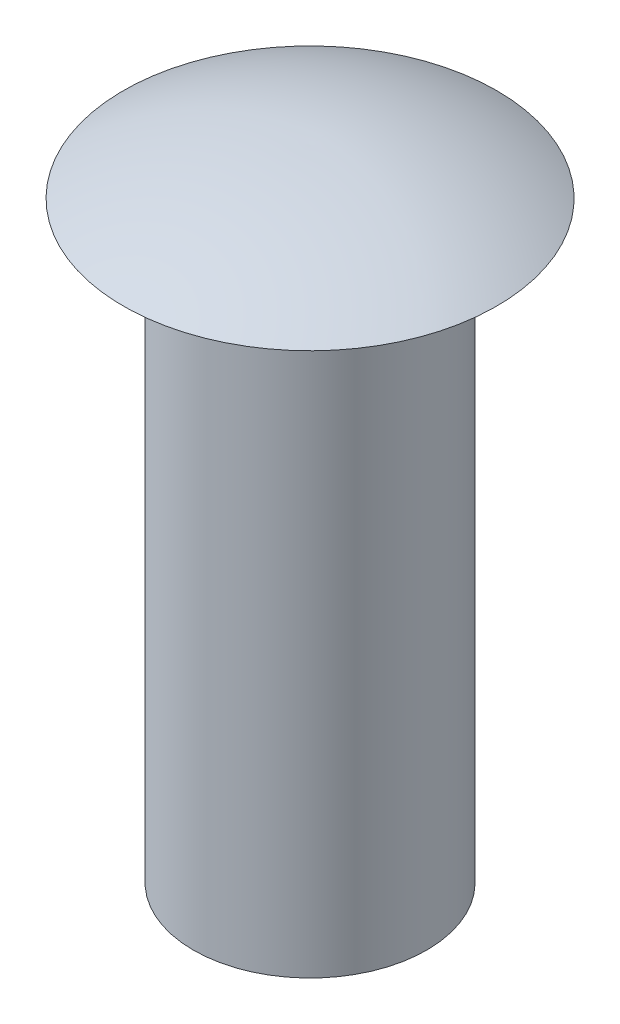
ISO-10303-21;
HEADER;
FILE_DESCRIPTION(('STEP AP214'),'2;1');
FILE_NAME('part.step','',(''),(''),'','','');
FILE_SCHEMA(('AUTOMOTIVE_DESIGN { 1 0 10303 214 1 1 1 1 }'));
ENDSEC;
DATA;
#1=APPLICATION_CONTEXT('core data for automotive mechanical design processes');
#2=APPLICATION_PROTOCOL_DEFINITION('international standard','automotive_design',2000,#1);
#3=PRODUCT_CONTEXT('',#1,'mechanical');
#4=PRODUCT('Part','Part','',(#3));
#5=PRODUCT_RELATED_PRODUCT_CATEGORY('part','',(#4));
#6=PRODUCT_DEFINITION_FORMATION('','',#4);
#7=PRODUCT_DEFINITION_CONTEXT('part definition',#1,'design');
#8=PRODUCT_DEFINITION('design','',#6,#7);
#9=PRODUCT_DEFINITION_SHAPE('','',#8);
#10=(LENGTH_UNIT() NAMED_UNIT(*) SI_UNIT(.MILLI.,.METRE.));
#11=(NAMED_UNIT(*) PLANE_ANGLE_UNIT() SI_UNIT($,.RADIAN.));
#12=(NAMED_UNIT(*) SI_UNIT($,.STERADIAN.) SOLID_ANGLE_UNIT());
#13=UNCERTAINTY_MEASURE_WITH_UNIT(LENGTH_MEASURE(1.E-05),#10,'distance_accuracy_value','');
#14=(GEOMETRIC_REPRESENTATION_CONTEXT(3) GLOBAL_UNCERTAINTY_ASSIGNED_CONTEXT((#13)) GLOBAL_UNIT_ASSIGNED_CONTEXT((#10,
#11,#12)) REPRESENTATION_CONTEXT('',''));
#15=CARTESIAN_POINT('',(0.,0.,0.));
#16=DIRECTION('',(0.,0.,1.));
#17=DIRECTION('',(1.,0.,0.));
#18=AXIS2_PLACEMENT_3D('',#15,#16,#17);
#19=CARTESIAN_POINT('',(0.,12.7,0.));
#20=DIRECTION('',(0.,-1.,0.));
#21=DIRECTION('',(0.,0.,-1.));
#22=AXIS2_PLACEMENT_3D('',#19,#20,#21);
#23=CYLINDRICAL_SURFACE('',#22,2.5);
#24=CARTESIAN_POINT('',(0.,12.7,0.));
#25=DIRECTION('',(0.,1.,0.));
#26=DIRECTION('',(0.,0.,1.));
#27=AXIS2_PLACEMENT_3D('',#24,#25,#26);
#28=CIRCLE('',#27,2.5);
#29=CARTESIAN_POINT('',(0.,12.7,2.5));
#30=VERTEX_POINT('',#29);
#31=EDGE_CURVE('E11',#30,#30,#28,.T.);
#32=ORIENTED_EDGE('',*,*,#31,.F.);
#33=EDGE_LOOP('',(#32));
#34=FACE_BOUND('',#33,.T.);
#35=CARTESIAN_POINT('',(0.,0.,0.));
#36=DIRECTION('',(0.,1.,0.));
#37=DIRECTION('',(0.,0.,1.));
#38=AXIS2_PLACEMENT_3D('',#35,#36,#37);
#39=CIRCLE('',#38,2.5);
#40=CARTESIAN_POINT('',(0.,0.,2.5));
#41=VERTEX_POINT('',#40);
#42=EDGE_CURVE('E42',#41,#41,#39,.T.);
#43=ORIENTED_EDGE('',*,*,#42,.T.);
#44=EDGE_LOOP('',(#43));
#45=FACE_BOUND('',#44,.T.);
#46=ADVANCED_FACE('F39',(#34,#45),#23,.T.);
#47=CARTESIAN_POINT('',(0.,0.,0.));
#48=DIRECTION('',(0.,1.,0.));
#49=DIRECTION('',(0.,0.,1.));
#50=AXIS2_PLACEMENT_3D('',#47,#48,#49);
#51=PLANE('',#50);
#52=ORIENTED_EDGE('',*,*,#42,.F.);
#53=EDGE_LOOP('',(#52));
#54=FACE_BOUND('',#53,.T.);
#55=ADVANCED_FACE('F65',(#54),#51,.F.);
#56=CARTESIAN_POINT('',(0.,12.7,0.));
#57=DIRECTION('',(0.,-1.,0.));
#58=DIRECTION('',(0.,0.,-1.));
#59=AXIS2_PLACEMENT_3D('',#56,#57,#58);
#60=PLANE('',#59);
#61=ORIENTED_EDGE('',*,*,#31,.T.);
#62=EDGE_LOOP('',(#61));
#63=FACE_BOUND('',#62,.T.);
#64=CARTESIAN_POINT('',(0.,12.7,0.));
#65=DIRECTION('',(0.,-1.,0.));
#66=DIRECTION('',(0.,0.,-1.));
#67=AXIS2_PLACEMENT_3D('',#64,#65,#66);
#68=CIRCLE('',#67,4.);
#69=CARTESIAN_POINT('',(0.,12.7,-4.));
#70=VERTEX_POINT('',#69);
#71=EDGE_CURVE('E56',#70,#70,#68,.T.);
#72=ORIENTED_EDGE('',*,*,#71,.T.);
#73=EDGE_LOOP('',(#72));
#74=FACE_BOUND('',#73,.T.);
#75=ADVANCED_FACE('F52',(#63,#74),#60,.T.);
#76=CARTESIAN_POINT('',(0.,5.6914871775625,-0.122871794390625));
#77=DIRECTION('',(-1.,0.,0.));
#78=DIRECTION('',(0.,0.,-1.));
#79=AXIS2_PLACEMENT_3D('',#76,#77,#78);
#80=CIRCLE('',#79,8.00945535632746);
#81=TRIMMED_CURVE('',#80,(PARAMETER_VALUE(-1.58613777123845)),
(PARAMETER_VALUE(1.58613777123845)),.T.,.PARAMETER.);
#82=CARTESIAN_POINT('',(0.,5.6914871775625,0.));
#83=DIRECTION('',(0.,-1.,0.));
#84=AXIS1_PLACEMENT('',#82,#83);
#85=SURFACE_OF_REVOLUTION('',#81,#84);
#86=CARTESIAN_POINT('',(0.,13.7,0.));
#87=VERTEX_POINT('',#86);
#88=VERTEX_LOOP('',#87);
#89=FACE_BOUND('',#88,.T.);
#90=ORIENTED_EDGE('',*,*,#71,.F.);
#91=EDGE_LOOP('',(#90));
#92=FACE_BOUND('',#91,.T.);
#93=ADVANCED_FACE('F49',(#89,#92),#85,.T.);
#94=CLOSED_SHELL('',(#46,#55,#75,#93));
#95=MANIFOLD_SOLID_BREP('B2',#94);
#96=ADVANCED_BREP_SHAPE_REPRESENTATION('',(#18,#95),#14);
#97=SHAPE_DEFINITION_REPRESENTATION(#9,#96);
ENDSEC;
END-ISO-10303-21;
